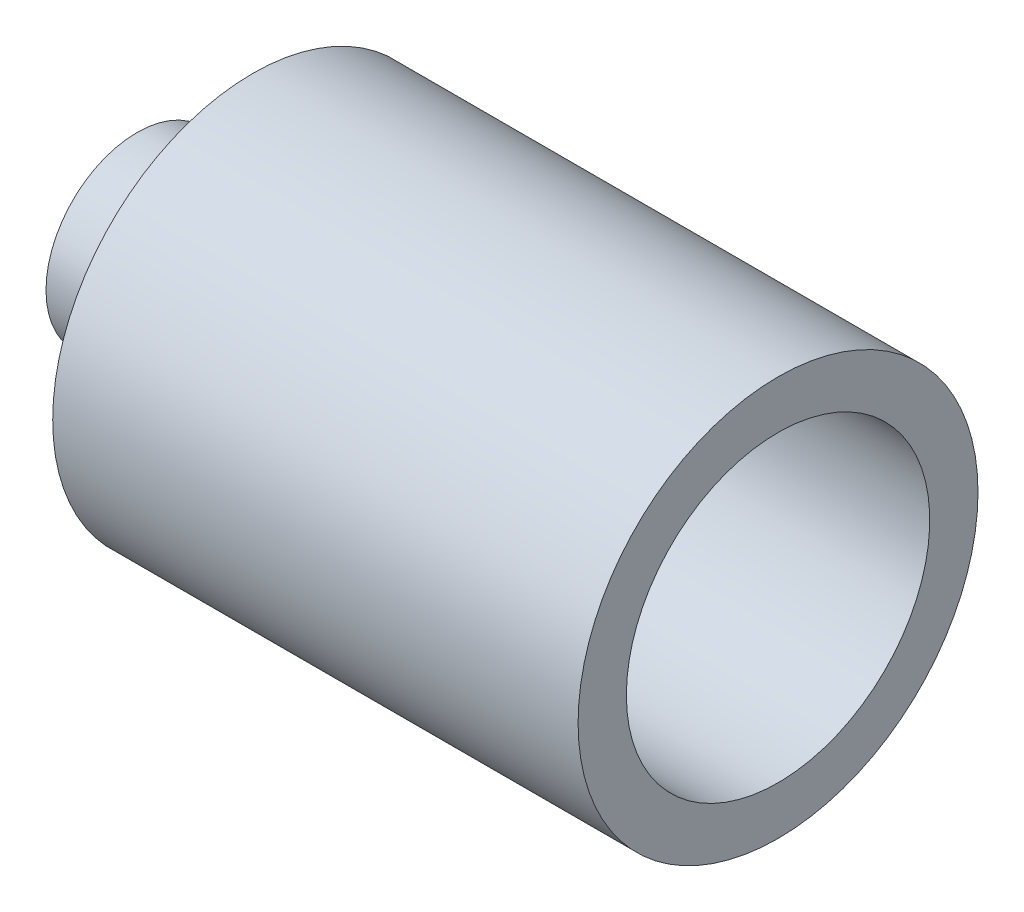
ISO-10303-21;
HEADER;
FILE_DESCRIPTION(('STEP AP214'),'2;1');
FILE_NAME('part.step','',(''),(''),'','','');
FILE_SCHEMA(('AUTOMOTIVE_DESIGN { 1 0 10303 214 1 1 1 1 }'));
ENDSEC;
DATA;
#1=APPLICATION_CONTEXT('core data for automotive mechanical design processes');
#2=APPLICATION_PROTOCOL_DEFINITION('international standard','automotive_design',2000,#1);
#3=PRODUCT_CONTEXT('',#1,'mechanical');
#4=PRODUCT('Part','Part','',(#3));
#5=PRODUCT_RELATED_PRODUCT_CATEGORY('part','',(#4));
#6=PRODUCT_DEFINITION_FORMATION('','',#4);
#7=PRODUCT_DEFINITION_CONTEXT('part definition',#1,'design');
#8=PRODUCT_DEFINITION('design','',#6,#7);
#9=PRODUCT_DEFINITION_SHAPE('','',#8);
#10=(LENGTH_UNIT() NAMED_UNIT(*) SI_UNIT(.MILLI.,.METRE.));
#11=(NAMED_UNIT(*) PLANE_ANGLE_UNIT() SI_UNIT($,.RADIAN.));
#12=(NAMED_UNIT(*) SI_UNIT($,.STERADIAN.) SOLID_ANGLE_UNIT());
#13=UNCERTAINTY_MEASURE_WITH_UNIT(LENGTH_MEASURE(1.E-05),#10,'distance_accuracy_value','');
#14=(GEOMETRIC_REPRESENTATION_CONTEXT(3) GLOBAL_UNCERTAINTY_ASSIGNED_CONTEXT((#13)) GLOBAL_UNIT_ASSIGNED_CONTEXT((#10,
#11,#12)) REPRESENTATION_CONTEXT('',''));
#15=CARTESIAN_POINT('',(0.,0.,0.));
#16=DIRECTION('',(0.,0.,1.));
#17=DIRECTION('',(1.,0.,0.));
#18=AXIS2_PLACEMENT_3D('',#15,#16,#17);
#19=CARTESIAN_POINT('',(0.,0.,0.));
#20=DIRECTION('',(-1.,0.,0.));
#21=DIRECTION('',(0.,0.,1.));
#22=AXIS2_PLACEMENT_3D('',#19,#20,#21);
#23=CYLINDRICAL_SURFACE('',#22,11.);
#24=CARTESIAN_POINT('',(38.1,0.,0.));
#25=DIRECTION('',(-1.,0.,0.));
#26=DIRECTION('',(0.,0.,1.));
#27=AXIS2_PLACEMENT_3D('',#24,#25,#26);
#28=CIRCLE('',#27,11.);
#29=CARTESIAN_POINT('',(38.1,0.,11.));
#30=VERTEX_POINT('',#29);
#31=EDGE_CURVE('E12',#30,#30,#28,.T.);
#32=ORIENTED_EDGE('',*,*,#31,.F.);
#33=EDGE_LOOP('',(#32));
#34=FACE_BOUND('',#33,.T.);
#35=CARTESIAN_POINT('',(5.08,0.,0.));
#36=DIRECTION('',(-1.,0.,0.));
#37=DIRECTION('',(0.,0.,1.));
#38=AXIS2_PLACEMENT_3D('',#35,#36,#37);
#39=CIRCLE('',#38,11.);
#40=CARTESIAN_POINT('',(5.08,0.,11.));
#41=VERTEX_POINT('',#40);
#42=EDGE_CURVE('E71',#41,#41,#39,.T.);
#43=ORIENTED_EDGE('',*,*,#42,.T.);
#44=EDGE_LOOP('',(#43));
#45=FACE_BOUND('',#44,.T.);
#46=ADVANCED_FACE('F43',(#34,#45),#23,.F.);
#47=CARTESIAN_POINT('',(38.1,11.,0.));
#48=DIRECTION('',(-1.,0.,0.));
#49=DIRECTION('',(0.,0.,1.));
#50=AXIS2_PLACEMENT_3D('',#47,#48,#49);
#51=PLANE('',#50);
#52=CARTESIAN_POINT('',(38.1,0.,0.));
#53=DIRECTION('',(-1.,0.,0.));
#54=DIRECTION('',(0.,0.,1.));
#55=AXIS2_PLACEMENT_3D('',#52,#53,#54);
#56=CIRCLE('',#55,14.5);
#57=CARTESIAN_POINT('',(38.1,0.,14.5));
#58=VERTEX_POINT('',#57);
#59=EDGE_CURVE('E49',#58,#58,#56,.T.);
#60=ORIENTED_EDGE('',*,*,#59,.F.);
#61=EDGE_LOOP('',(#60));
#62=FACE_BOUND('',#61,.T.);
#63=ORIENTED_EDGE('',*,*,#31,.T.);
#64=EDGE_LOOP('',(#63));
#65=FACE_BOUND('',#64,.T.);
#66=ADVANCED_FACE('F108',(#62,#65),#51,.F.);
#67=CARTESIAN_POINT('',(0.,0.,0.));
#68=DIRECTION('',(-1.,0.,0.));
#69=DIRECTION('',(0.,0.,1.));
#70=AXIS2_PLACEMENT_3D('',#67,#68,#69);
#71=CYLINDRICAL_SURFACE('',#70,14.5);
#72=CARTESIAN_POINT('',(0.,0.,0.));
#73=DIRECTION('',(-1.,0.,0.));
#74=DIRECTION('',(0.,0.,1.));
#75=AXIS2_PLACEMENT_3D('',#72,#73,#74);
#76=CIRCLE('',#75,14.5);
#77=CARTESIAN_POINT('',(0.,0.,14.5));
#78=VERTEX_POINT('',#77);
#79=EDGE_CURVE('E53',#78,#78,#76,.T.);
#80=ORIENTED_EDGE('',*,*,#79,.F.);
#81=EDGE_LOOP('',(#80));
#82=FACE_BOUND('',#81,.T.);
#83=ORIENTED_EDGE('',*,*,#59,.T.);
#84=EDGE_LOOP('',(#83));
#85=FACE_BOUND('',#84,.T.);
#86=ADVANCED_FACE('F103',(#82,#85),#71,.T.);
#87=CARTESIAN_POINT('',(0.,14.5,0.));
#88=DIRECTION('',(1.,0.,0.));
#89=DIRECTION('',(0.,0.,-1.));
#90=AXIS2_PLACEMENT_3D('',#87,#88,#89);
#91=PLANE('',#90);
#92=CARTESIAN_POINT('',(0.,0.,0.));
#93=DIRECTION('',(-1.,0.,0.));
#94=DIRECTION('',(0.,0.,1.));
#95=AXIS2_PLACEMENT_3D('',#92,#93,#94);
#96=CIRCLE('',#95,6.604);
#97=CARTESIAN_POINT('',(0.,0.,6.604));
#98=VERTEX_POINT('',#97);
#99=EDGE_CURVE('E57',#98,#98,#96,.T.);
#100=ORIENTED_EDGE('',*,*,#99,.F.);
#101=EDGE_LOOP('',(#100));
#102=FACE_BOUND('',#101,.T.);
#103=ORIENTED_EDGE('',*,*,#79,.T.);
#104=EDGE_LOOP('',(#103));
#105=FACE_BOUND('',#104,.T.);
#106=ADVANCED_FACE('F97',(#102,#105),#91,.F.);
#107=CARTESIAN_POINT('',(0.,0.,0.));
#108=DIRECTION('',(-1.,0.,0.));
#109=DIRECTION('',(0.,0.,1.));
#110=AXIS2_PLACEMENT_3D('',#107,#108,#109);
#111=CYLINDRICAL_SURFACE('',#110,6.604);
#112=CARTESIAN_POINT('',(-8.382,0.,0.));
#113=DIRECTION('',(-1.,0.,0.));
#114=DIRECTION('',(0.,0.,1.));
#115=AXIS2_PLACEMENT_3D('',#112,#113,#114);
#116=CIRCLE('',#115,6.604);
#117=CARTESIAN_POINT('',(-8.382,0.,6.604));
#118=VERTEX_POINT('',#117);
#119=EDGE_CURVE('E62',#118,#118,#116,.T.);
#120=ORIENTED_EDGE('',*,*,#119,.F.);
#121=EDGE_LOOP('',(#120));
#122=FACE_BOUND('',#121,.T.);
#123=ORIENTED_EDGE('',*,*,#99,.T.);
#124=EDGE_LOOP('',(#123));
#125=FACE_BOUND('',#124,.T.);
#126=ADVANCED_FACE('F91',(#122,#125),#111,.T.);
#127=CARTESIAN_POINT('',(-8.382,6.604,0.));
#128=DIRECTION('',(1.,0.,0.));
#129=DIRECTION('',(0.,0.,-1.));
#130=AXIS2_PLACEMENT_3D('',#127,#128,#129);
#131=PLANE('',#130);
#132=CARTESIAN_POINT('',(-8.382,0.,0.));
#133=DIRECTION('',(-1.,0.,0.));
#134=DIRECTION('',(0.,0.,1.));
#135=AXIS2_PLACEMENT_3D('',#132,#133,#134);
#136=CIRCLE('',#135,3.429);
#137=CARTESIAN_POINT('',(-8.382,0.,3.429));
#138=VERTEX_POINT('',#137);
#139=EDGE_CURVE('E65',#138,#138,#136,.T.);
#140=ORIENTED_EDGE('',*,*,#139,.F.);
#141=EDGE_LOOP('',(#140));
#142=FACE_BOUND('',#141,.T.);
#143=ORIENTED_EDGE('',*,*,#119,.T.);
#144=EDGE_LOOP('',(#143));
#145=FACE_BOUND('',#144,.T.);
#146=ADVANCED_FACE('F85',(#142,#145),#131,.F.);
#147=CARTESIAN_POINT('',(0.,0.,0.));
#148=DIRECTION('',(-1.,0.,0.));
#149=DIRECTION('',(0.,0.,1.));
#150=AXIS2_PLACEMENT_3D('',#147,#148,#149);
#151=CYLINDRICAL_SURFACE('',#150,3.429);
#152=CARTESIAN_POINT('',(5.08,0.,0.));
#153=DIRECTION('',(-1.,0.,0.));
#154=DIRECTION('',(0.,0.,1.));
#155=AXIS2_PLACEMENT_3D('',#152,#153,#154);
#156=CIRCLE('',#155,3.429);
#157=CARTESIAN_POINT('',(5.08,0.,3.429));
#158=VERTEX_POINT('',#157);
#159=EDGE_CURVE('E68',#158,#158,#156,.T.);
#160=ORIENTED_EDGE('',*,*,#159,.F.);
#161=EDGE_LOOP('',(#160));
#162=FACE_BOUND('',#161,.T.);
#163=ORIENTED_EDGE('',*,*,#139,.T.);
#164=EDGE_LOOP('',(#163));
#165=FACE_BOUND('',#164,.T.);
#166=ADVANCED_FACE('F79',(#162,#165),#151,.F.);
#167=CARTESIAN_POINT('',(5.08,11.,0.));
#168=DIRECTION('',(-1.,0.,0.));
#169=DIRECTION('',(0.,0.,1.));
#170=AXIS2_PLACEMENT_3D('',#167,#168,#169);
#171=PLANE('',#170);
#172=ORIENTED_EDGE('',*,*,#42,.F.);
#173=EDGE_LOOP('',(#172));
#174=FACE_BOUND('',#173,.T.);
#175=ORIENTED_EDGE('',*,*,#159,.T.);
#176=EDGE_LOOP('',(#175));
#177=FACE_BOUND('',#176,.T.);
#178=ADVANCED_FACE('F76',(#174,#177),#171,.F.);
#179=CLOSED_SHELL('',(#46,#66,#86,#106,#126,#146,#166,#178));
#180=MANIFOLD_SOLID_BREP('B2',#179);
#181=ADVANCED_BREP_SHAPE_REPRESENTATION('',(#18,#180),#14);
#182=SHAPE_DEFINITION_REPRESENTATION(#9,#181);
ENDSEC;
END-ISO-10303-21;
